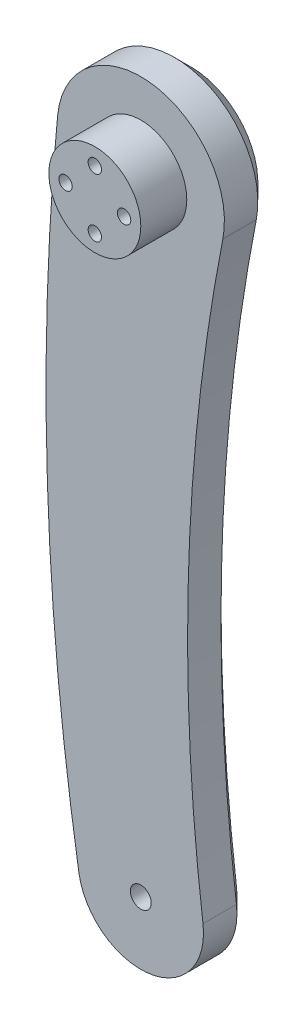
ISO-10303-21;
HEADER;
FILE_DESCRIPTION(('STEP AP214'),'2;1');
FILE_NAME('part.step','',(''),(''),'','','');
FILE_SCHEMA(('AUTOMOTIVE_DESIGN { 1 0 10303 214 1 1 1 1 }'));
ENDSEC;
DATA;
#1=APPLICATION_CONTEXT('core data for automotive mechanical design processes');
#2=APPLICATION_PROTOCOL_DEFINITION('international standard','automotive_design',2000,#1);
#3=PRODUCT_CONTEXT('',#1,'mechanical');
#4=PRODUCT('Part','Part','',(#3));
#5=PRODUCT_RELATED_PRODUCT_CATEGORY('part','',(#4));
#6=PRODUCT_DEFINITION_FORMATION('','',#4);
#7=PRODUCT_DEFINITION_CONTEXT('part definition',#1,'design');
#8=PRODUCT_DEFINITION('design','',#6,#7);
#9=PRODUCT_DEFINITION_SHAPE('','',#8);
#10=(LENGTH_UNIT() NAMED_UNIT(*) SI_UNIT(.MILLI.,.METRE.));
#11=(NAMED_UNIT(*) PLANE_ANGLE_UNIT() SI_UNIT($,.RADIAN.));
#12=(NAMED_UNIT(*) SI_UNIT($,.STERADIAN.) SOLID_ANGLE_UNIT());
#13=UNCERTAINTY_MEASURE_WITH_UNIT(LENGTH_MEASURE(1.E-05),#10,'distance_accuracy_value','');
#14=(GEOMETRIC_REPRESENTATION_CONTEXT(3) GLOBAL_UNCERTAINTY_ASSIGNED_CONTEXT((#13)) GLOBAL_UNIT_ASSIGNED_CONTEXT((#10,
#11,#12)) REPRESENTATION_CONTEXT('',''));
#15=CARTESIAN_POINT('',(0.,0.,0.));
#16=DIRECTION('',(0.,0.,1.));
#17=DIRECTION('',(1.,0.,0.));
#18=AXIS2_PLACEMENT_3D('',#15,#16,#17);
#19=CARTESIAN_POINT('',(-7.,0.,-0.000999999999999265));
#20=DIRECTION('',(0.,0.,1.));
#21=DIRECTION('',(1.,0.,0.));
#22=AXIS2_PLACEMENT_3D('',#19,#20,#21);
#23=CYLINDRICAL_SURFACE('',#22,1.6);
#24=CARTESIAN_POINT('',(-7.,0.,23.));
#25=DIRECTION('',(0.,0.,1.));
#26=DIRECTION('',(1.,0.,0.));
#27=AXIS2_PLACEMENT_3D('',#24,#25,#26);
#28=CIRCLE('',#27,1.6);
#29=CARTESIAN_POINT('',(-5.4,0.,23.));
#30=VERTEX_POINT('',#29);
#31=EDGE_CURVE('E160',#30,#30,#28,.T.);
#32=ORIENTED_EDGE('',*,*,#31,.T.);
#33=EDGE_LOOP('',(#32));
#34=FACE_BOUND('',#33,.T.);
#35=CARTESIAN_POINT('',(-7.,0.,18.));
#36=DIRECTION('',(0.,0.,-1.));
#37=DIRECTION('',(-1.,0.,0.));
#38=AXIS2_PLACEMENT_3D('',#35,#36,#37);
#39=CIRCLE('',#38,1.6);
#40=CARTESIAN_POINT('',(-8.6,0.,18.));
#41=VERTEX_POINT('',#40);
#42=EDGE_CURVE('E42',#41,#41,#39,.F.);
#43=ORIENTED_EDGE('',*,*,#42,.F.);
#44=EDGE_LOOP('',(#43));
#45=FACE_BOUND('',#44,.T.);
#46=ADVANCED_FACE('F37',(#34,#45),#23,.F.);
#47=CARTESIAN_POINT('',(0.,-7.,-0.000999999999999265));
#48=DIRECTION('',(0.,0.,1.));
#49=DIRECTION('',(1.,0.,0.));
#50=AXIS2_PLACEMENT_3D('',#47,#48,#49);
#51=CYLINDRICAL_SURFACE('',#50,1.6);
#52=CARTESIAN_POINT('',(0.,-7.,23.));
#53=DIRECTION('',(0.,0.,1.));
#54=DIRECTION('',(1.,0.,0.));
#55=AXIS2_PLACEMENT_3D('',#52,#53,#54);
#56=CIRCLE('',#55,1.6);
#57=CARTESIAN_POINT('',(1.6,-7.,23.));
#58=VERTEX_POINT('',#57);
#59=EDGE_CURVE('E165',#58,#58,#56,.T.);
#60=ORIENTED_EDGE('',*,*,#59,.T.);
#61=EDGE_LOOP('',(#60));
#62=FACE_BOUND('',#61,.T.);
#63=CARTESIAN_POINT('',(0.,-7.,18.));
#64=DIRECTION('',(0.,0.,-1.));
#65=DIRECTION('',(-1.,0.,0.));
#66=AXIS2_PLACEMENT_3D('',#63,#64,#65);
#67=CIRCLE('',#66,1.6);
#68=CARTESIAN_POINT('',(-1.6,-7.,18.));
#69=VERTEX_POINT('',#68);
#70=EDGE_CURVE('E151',#69,#69,#67,.F.);
#71=ORIENTED_EDGE('',*,*,#70,.F.);
#72=EDGE_LOOP('',(#71));
#73=FACE_BOUND('',#72,.T.);
#74=ADVANCED_FACE('F216',(#62,#73),#51,.F.);
#75=CARTESIAN_POINT('',(7.,0.,-0.000999999999999265));
#76=DIRECTION('',(0.,0.,1.));
#77=DIRECTION('',(1.,0.,0.));
#78=AXIS2_PLACEMENT_3D('',#75,#76,#77);
#79=CYLINDRICAL_SURFACE('',#78,1.6);
#80=CARTESIAN_POINT('',(7.,0.,23.));
#81=DIRECTION('',(0.,0.,1.));
#82=DIRECTION('',(1.,0.,0.));
#83=AXIS2_PLACEMENT_3D('',#80,#81,#82);
#84=CIRCLE('',#83,1.6);
#85=CARTESIAN_POINT('',(8.6,0.,23.));
#86=VERTEX_POINT('',#85);
#87=EDGE_CURVE('E173',#86,#86,#84,.T.);
#88=ORIENTED_EDGE('',*,*,#87,.T.);
#89=EDGE_LOOP('',(#88));
#90=FACE_BOUND('',#89,.T.);
#91=CARTESIAN_POINT('',(7.,0.,18.));
#92=DIRECTION('',(0.,0.,-1.));
#93=DIRECTION('',(-1.,0.,0.));
#94=AXIS2_PLACEMENT_3D('',#91,#92,#93);
#95=CIRCLE('',#94,1.6);
#96=CARTESIAN_POINT('',(5.4,0.,18.));
#97=VERTEX_POINT('',#96);
#98=EDGE_CURVE('E148',#97,#97,#95,.F.);
#99=ORIENTED_EDGE('',*,*,#98,.F.);
#100=EDGE_LOOP('',(#99));
#101=FACE_BOUND('',#100,.T.);
#102=ADVANCED_FACE('F222',(#90,#101),#79,.F.);
#103=CARTESIAN_POINT('',(0.,7.,-0.000999999999999265));
#104=DIRECTION('',(0.,0.,1.));
#105=DIRECTION('',(1.,0.,0.));
#106=AXIS2_PLACEMENT_3D('',#103,#104,#105);
#107=CYLINDRICAL_SURFACE('',#106,1.6);
#108=CARTESIAN_POINT('',(0.,7.,23.));
#109=DIRECTION('',(0.,0.,1.));
#110=DIRECTION('',(1.,0.,0.));
#111=AXIS2_PLACEMENT_3D('',#108,#109,#110);
#112=CIRCLE('',#111,1.6);
#113=CARTESIAN_POINT('',(1.6,7.,23.));
#114=VERTEX_POINT('',#113);
#115=EDGE_CURVE('E156',#114,#114,#112,.T.);
#116=ORIENTED_EDGE('',*,*,#115,.T.);
#117=EDGE_LOOP('',(#116));
#118=FACE_BOUND('',#117,.T.);
#119=CARTESIAN_POINT('',(0.,7.,18.));
#120=DIRECTION('',(0.,0.,-1.));
#121=DIRECTION('',(-1.,0.,0.));
#122=AXIS2_PLACEMENT_3D('',#119,#120,#121);
#123=CIRCLE('',#122,1.6);
#124=CARTESIAN_POINT('',(-1.6,7.,18.));
#125=VERTEX_POINT('',#124);
#126=EDGE_CURVE('E145',#125,#125,#123,.F.);
#127=ORIENTED_EDGE('',*,*,#126,.F.);
#128=EDGE_LOOP('',(#127));
#129=FACE_BOUND('',#128,.T.);
#130=ADVANCED_FACE('F230',(#118,#129),#107,.F.);
#131=CARTESIAN_POINT('',(288.665244294995,-102.791666666667,12.));
#132=DIRECTION('',(0.,0.,1.));
#133=DIRECTION('',(1.,0.,0.));
#134=AXIS2_PLACEMENT_3D('',#131,#132,#133);
#135=PLANE('',#134);
#136=CARTESIAN_POINT('',(577.330488589989,-55.5833333333334,12.));
#137=DIRECTION('',(0.,0.,1.));
#138=DIRECTION('',(1.,0.,0.));
#139=AXIS2_PLACEMENT_3D('',#136,#137,#138);
#140=CIRCLE('',#139,600.);
#141=CARTESIAN_POINT('',(-19.9079478824134,1.91666666666666,12.));
#142=VERTEX_POINT('',#141);
#143=CARTESIAN_POINT('',(-14.8033458612818,-152.42094017094,12.));
#144=VERTEX_POINT('',#143);
#145=EDGE_CURVE('E105',#142,#144,#140,.T.);
#146=ORIENTED_EDGE('',*,*,#145,.T.);
#147=CARTESIAN_POINT('',(0.,-150.,12.));
#148=DIRECTION('',(0.,0.,1.));
#149=DIRECTION('',(1.,0.,0.));
#150=AXIS2_PLACEMENT_3D('',#147,#148,#149);
#151=CIRCLE('',#150,15.);
#152=CARTESIAN_POINT('',(14.8770423434527,-148.083333333333,12.));
#153=VERTEX_POINT('',#152);
#154=EDGE_CURVE('E94',#144,#153,#151,.T.);
#155=ORIENTED_EDGE('',*,*,#154,.T.);
#156=CARTESIAN_POINT('',(461.188312647038,-90.5833333333334,12.));
#157=DIRECTION('',(0.,0.,-1.));
#158=DIRECTION('',(1.,0.,0.));
#159=AXIS2_PLACEMENT_3D('',#156,#157,#158);
#160=CIRCLE('',#159,450.);
#161=CARTESIAN_POINT('',(19.625034580725,-3.85460992907802,12.));
#162=VERTEX_POINT('',#161);
#163=EDGE_CURVE('E104',#153,#162,#160,.T.);
#164=ORIENTED_EDGE('',*,*,#163,.T.);
#165=CARTESIAN_POINT('',(0.,0.,12.));
#166=DIRECTION('',(0.,0.,1.));
#167=DIRECTION('',(1.,0.,0.));
#168=AXIS2_PLACEMENT_3D('',#165,#166,#167);
#169=CIRCLE('',#168,20.);
#170=EDGE_CURVE('E111',#162,#142,#169,.T.);
#171=ORIENTED_EDGE('',*,*,#170,.T.);
#172=EDGE_LOOP('',(#146,#155,#164,#171));
#173=FACE_BOUND('',#172,.T.);
#174=CARTESIAN_POINT('',(0.,-150.,12.));
#175=DIRECTION('',(0.,0.,1.));
#176=DIRECTION('',(1.,0.,0.));
#177=AXIS2_PLACEMENT_3D('',#174,#175,#176);
#178=CIRCLE('',#177,2.5);
#179=CARTESIAN_POINT('',(2.49999999999999,-150.,12.));
#180=VERTEX_POINT('',#179);
#181=EDGE_CURVE('E180',#180,#180,#178,.T.);
#182=ORIENTED_EDGE('',*,*,#181,.F.);
#183=EDGE_LOOP('',(#182));
#184=FACE_BOUND('',#183,.T.);
#185=CARTESIAN_POINT('',(0.,0.,12.));
#186=DIRECTION('',(0.,0.,1.));
#187=DIRECTION('',(1.,0.,0.));
#188=AXIS2_PLACEMENT_3D('',#185,#186,#187);
#189=CIRCLE('',#188,11.);
#190=CARTESIAN_POINT('',(11.,0.,12.));
#191=VERTEX_POINT('',#190);
#192=EDGE_CURVE('E176',#191,#191,#189,.T.);
#193=ORIENTED_EDGE('',*,*,#192,.F.);
#194=EDGE_LOOP('',(#193));
#195=FACE_BOUND('',#194,.T.);
#196=ADVANCED_FACE('F108',(#173,#184,#195),#135,.T.);
#197=CARTESIAN_POINT('',(577.330488589989,-55.5833333333334,12.));
#198=DIRECTION('',(0.,0.,-1.));
#199=DIRECTION('',(-1.,0.,0.));
#200=AXIS2_PLACEMENT_3D('',#197,#198,#199);
#201=CYLINDRICAL_SURFACE('',#200,600.);
#202=DIRECTION('',(0.,0.,-1.));
#203=VECTOR('',#202,1.);
#204=CARTESIAN_POINT('',(-19.9079478824134,1.91666666666666,12.));
#205=LINE('',#204,#203);
#206=CARTESIAN_POINT('',(-19.9079478824134,1.91666666666666,4.));
#207=VERTEX_POINT('',#206);
#208=EDGE_CURVE('E189',#142,#207,#205,.T.);
#209=ORIENTED_EDGE('',*,*,#208,.T.);
#210=CARTESIAN_POINT('',(577.330488589989,-55.5833333333334,4.));
#211=DIRECTION('',(0.,0.,1.));
#212=DIRECTION('',(1.,0.,0.));
#213=AXIS2_PLACEMENT_3D('',#210,#211,#212);
#214=CIRCLE('',#213,600.);
#215=CARTESIAN_POINT('',(-14.8033458612818,-152.42094017094,4.));
#216=VERTEX_POINT('',#215);
#217=EDGE_CURVE('E11',#207,#216,#214,.T.);
#218=ORIENTED_EDGE('',*,*,#217,.T.);
#219=DIRECTION('',(0.,0.,-1.));
#220=VECTOR('',#219,1.);
#221=CARTESIAN_POINT('',(-14.8033458612818,-152.42094017094,12.));
#222=LINE('',#221,#220);
#223=EDGE_CURVE('E99',#144,#216,#222,.T.);
#224=ORIENTED_EDGE('',*,*,#223,.F.);
#225=ORIENTED_EDGE('',*,*,#145,.F.);
#226=EDGE_LOOP('',(#209,#218,#224,#225));
#227=FACE_BOUND('',#226,.T.);
#228=ADVANCED_FACE('F115',(#227),#201,.T.);
#229=CARTESIAN_POINT('',(0.,-150.,12.));
#230=DIRECTION('',(0.,0.,-1.));
#231=DIRECTION('',(-1.,0.,0.));
#232=AXIS2_PLACEMENT_3D('',#229,#230,#231);
#233=CYLINDRICAL_SURFACE('',#232,15.);
#234=ORIENTED_EDGE('',*,*,#223,.T.);
#235=CARTESIAN_POINT('',(0.,-150.,4.));
#236=DIRECTION('',(0.,0.,1.));
#237=DIRECTION('',(1.,0.,0.));
#238=AXIS2_PLACEMENT_3D('',#235,#236,#237);
#239=CIRCLE('',#238,15.);
#240=CARTESIAN_POINT('',(14.8770423434527,-148.083333333333,4.));
#241=VERTEX_POINT('',#240);
#242=EDGE_CURVE('E117',#216,#241,#239,.T.);
#243=ORIENTED_EDGE('',*,*,#242,.T.);
#244=DIRECTION('',(0.,0.,-1.));
#245=VECTOR('',#244,1.);
#246=CARTESIAN_POINT('',(14.8770423434527,-148.083333333333,12.));
#247=LINE('',#246,#245);
#248=EDGE_CURVE('E101',#153,#241,#247,.T.);
#249=ORIENTED_EDGE('',*,*,#248,.F.);
#250=ORIENTED_EDGE('',*,*,#154,.F.);
#251=EDGE_LOOP('',(#234,#243,#249,#250));
#252=FACE_BOUND('',#251,.T.);
#253=ADVANCED_FACE('F96',(#252),#233,.T.);
#254=CARTESIAN_POINT('',(461.188312647038,-90.5833333333334,12.));
#255=DIRECTION('',(0.,0.,-1.));
#256=DIRECTION('',(-1.,0.,0.));
#257=AXIS2_PLACEMENT_3D('',#254,#255,#256);
#258=CYLINDRICAL_SURFACE('',#257,450.);
#259=ORIENTED_EDGE('',*,*,#248,.T.);
#260=CARTESIAN_POINT('',(461.188312647038,-90.5833333333334,4.));
#261=DIRECTION('',(0.,0.,1.));
#262=DIRECTION('',(1.,0.,0.));
#263=AXIS2_PLACEMENT_3D('',#260,#261,#262);
#264=CIRCLE('',#263,450.);
#265=CARTESIAN_POINT('',(19.625034580725,-3.85460992907802,4.));
#266=VERTEX_POINT('',#265);
#267=EDGE_CURVE('E62',#241,#266,#264,.F.);
#268=ORIENTED_EDGE('',*,*,#267,.T.);
#269=DIRECTION('',(0.,0.,-1.));
#270=VECTOR('',#269,1.);
#271=CARTESIAN_POINT('',(19.625034580725,-3.85460992907802,12.));
#272=LINE('',#271,#270);
#273=EDGE_CURVE('E121',#162,#266,#272,.T.);
#274=ORIENTED_EDGE('',*,*,#273,.F.);
#275=ORIENTED_EDGE('',*,*,#163,.F.);
#276=EDGE_LOOP('',(#259,#268,#274,#275));
#277=FACE_BOUND('',#276,.T.);
#278=ADVANCED_FACE('F236',(#277),#258,.F.);
#279=CARTESIAN_POINT('',(0.,0.,12.));
#280=DIRECTION('',(0.,0.,-1.));
#281=DIRECTION('',(-1.,0.,0.));
#282=AXIS2_PLACEMENT_3D('',#279,#280,#281);
#283=CYLINDRICAL_SURFACE('',#282,20.);
#284=ORIENTED_EDGE('',*,*,#273,.T.);
#285=CARTESIAN_POINT('',(0.,0.,4.));
#286=DIRECTION('',(0.,0.,1.));
#287=DIRECTION('',(1.,0.,0.));
#288=AXIS2_PLACEMENT_3D('',#285,#286,#287);
#289=CIRCLE('',#288,20.);
#290=EDGE_CURVE('E47',#266,#207,#289,.T.);
#291=ORIENTED_EDGE('',*,*,#290,.T.);
#292=ORIENTED_EDGE('',*,*,#208,.F.);
#293=ORIENTED_EDGE('',*,*,#170,.F.);
#294=EDGE_LOOP('',(#284,#291,#292,#293));
#295=FACE_BOUND('',#294,.T.);
#296=ADVANCED_FACE('F190',(#295),#283,.T.);
#297=CARTESIAN_POINT('',(288.665244294995,-102.791666666667,0.));
#298=DIRECTION('',(0.,0.,1.));
#299=DIRECTION('',(1.,0.,0.));
#300=AXIS2_PLACEMENT_3D('',#297,#298,#299);
#301=PLANE('',#300);
#302=CARTESIAN_POINT('',(0.,7.,0.));
#303=DIRECTION('',(0.,0.,-1.));
#304=DIRECTION('',(-1.,0.,0.));
#305=AXIS2_PLACEMENT_3D('',#302,#303,#304);
#306=CIRCLE('',#305,2.5);
#307=CARTESIAN_POINT('',(-2.5,7.,0.));
#308=VERTEX_POINT('',#307);
#309=EDGE_CURVE('E323',#308,#308,#306,.T.);
#310=ORIENTED_EDGE('',*,*,#309,.F.);
#311=EDGE_LOOP('',(#310));
#312=FACE_BOUND('',#311,.T.);
#313=CARTESIAN_POINT('',(-7.,0.,0.));
#314=DIRECTION('',(0.,0.,-1.));
#315=DIRECTION('',(-1.,0.,0.));
#316=AXIS2_PLACEMENT_3D('',#313,#314,#315);
#317=CIRCLE('',#316,2.5);
#318=CARTESIAN_POINT('',(-9.5,0.,0.));
#319=VERTEX_POINT('',#318);
#320=EDGE_CURVE('E331',#319,#319,#317,.T.);
#321=ORIENTED_EDGE('',*,*,#320,.F.);
#322=EDGE_LOOP('',(#321));
#323=FACE_BOUND('',#322,.T.);
#324=CARTESIAN_POINT('',(0.,-7.,0.));
#325=DIRECTION('',(0.,0.,-1.));
#326=DIRECTION('',(-1.,0.,0.));
#327=AXIS2_PLACEMENT_3D('',#324,#325,#326);
#328=CIRCLE('',#327,2.5);
#329=CARTESIAN_POINT('',(-2.5,-7.,0.));
#330=VERTEX_POINT('',#329);
#331=EDGE_CURVE('E337',#330,#330,#328,.T.);
#332=ORIENTED_EDGE('',*,*,#331,.F.);
#333=EDGE_LOOP('',(#332));
#334=FACE_BOUND('',#333,.T.);
#335=CARTESIAN_POINT('',(7.,0.,0.));
#336=DIRECTION('',(0.,0.,-1.));
#337=DIRECTION('',(-1.,0.,0.));
#338=AXIS2_PLACEMENT_3D('',#335,#336,#337);
#339=CIRCLE('',#338,2.5);
#340=CARTESIAN_POINT('',(4.5,0.,0.));
#341=VERTEX_POINT('',#340);
#342=EDGE_CURVE('E168',#341,#341,#339,.T.);
#343=ORIENTED_EDGE('',*,*,#342,.F.);
#344=EDGE_LOOP('',(#343));
#345=FACE_BOUND('',#344,.T.);
#346=CARTESIAN_POINT('',(0.,-150.,0.));
#347=DIRECTION('',(0.,0.,1.));
#348=DIRECTION('',(1.,0.,0.));
#349=AXIS2_PLACEMENT_3D('',#346,#347,#348);
#350=CIRCLE('',#349,2.5);
#351=CARTESIAN_POINT('',(2.49999999999999,-150.,0.));
#352=VERTEX_POINT('',#351);
#353=EDGE_CURVE('E138',#352,#352,#350,.F.);
#354=ORIENTED_EDGE('',*,*,#353,.F.);
#355=EDGE_LOOP('',(#354));
#356=FACE_BOUND('',#355,.T.);
#357=CARTESIAN_POINT('',(461.188312647038,-90.5833333333334,0.));
#358=DIRECTION('',(0.,0.,1.));
#359=DIRECTION('',(1.,0.,0.));
#360=AXIS2_PLACEMENT_3D('',#357,#358,#359);
#361=CIRCLE('',#360,454.);
#362=CARTESIAN_POINT('',(15.7000276645799,-3.08368794326239,0.));
#363=VERTEX_POINT('',#362);
#364=CARTESIAN_POINT('',(10.9098310518651,-148.594444444444,0.));
#365=VERTEX_POINT('',#364);
#366=EDGE_CURVE('E128',#363,#365,#361,.T.);
#367=ORIENTED_EDGE('',*,*,#366,.T.);
#368=CARTESIAN_POINT('',(0.,-150.,0.));
#369=DIRECTION('',(0.,0.,1.));
#370=DIRECTION('',(1.,0.,0.));
#371=AXIS2_PLACEMENT_3D('',#368,#369,#370);
#372=CIRCLE('',#371,10.9999999999998);
#373=CARTESIAN_POINT('',(-10.8557869649398,-151.775356125356,0.));
#374=VERTEX_POINT('',#373);
#375=EDGE_CURVE('E130',#365,#374,#372,.F.);
#376=ORIENTED_EDGE('',*,*,#375,.T.);
#377=CARTESIAN_POINT('',(577.330488589989,-55.5833333333334,0.));
#378=DIRECTION('',(0.,0.,1.));
#379=DIRECTION('',(1.,0.,0.));
#380=AXIS2_PLACEMENT_3D('',#377,#378,#379);
#381=CIRCLE('',#380,596.);
#382=CARTESIAN_POINT('',(-15.9263583059306,1.53333333333331,0.));
#383=VERTEX_POINT('',#382);
#384=EDGE_CURVE('E119',#374,#383,#381,.F.);
#385=ORIENTED_EDGE('',*,*,#384,.T.);
#386=CARTESIAN_POINT('',(0.,0.,0.));
#387=DIRECTION('',(0.,0.,1.));
#388=DIRECTION('',(1.,0.,0.));
#389=AXIS2_PLACEMENT_3D('',#386,#387,#388);
#390=CIRCLE('',#389,15.9999999999998);
#391=EDGE_CURVE('E126',#383,#363,#390,.F.);
#392=ORIENTED_EDGE('',*,*,#391,.T.);
#393=EDGE_LOOP('',(#367,#376,#385,#392));
#394=FACE_BOUND('',#393,.T.);
#395=ADVANCED_FACE('F201',(#312,#323,#334,#345,#356,#394),#301,.F.);
#396=CARTESIAN_POINT('',(0.,0.,4.));
#397=DIRECTION('',(0.,0.,1.));
#398=DIRECTION('',(1.,0.,0.));
#399=AXIS2_PLACEMENT_3D('',#396,#397,#398);
#400=CONICAL_SURFACE('',#399,20.,0.785398163397466);
#401=DIRECTION('',(0.69384975165257,-0.136281040984005,0.707106781186535));
#402=VECTOR('',#401,1.);
#403=CARTESIAN_POINT('',(15.7000276645799,-3.08368794326239,0.));
#404=LINE('',#403,#402);
#405=EDGE_CURVE('E140',#363,#266,#404,.T.);
#406=ORIENTED_EDGE('',*,*,#405,.F.);
#407=ORIENTED_EDGE('',*,*,#391,.F.);
#408=DIRECTION('',(0.703852247358157,-0.0677643998637131,-0.707106781186535));
#409=VECTOR('',#408,1.);
#410=CARTESIAN_POINT('',(-19.9079478824134,1.91666666666666,4.));
#411=LINE('',#410,#409);
#412=EDGE_CURVE('E113',#207,#383,#411,.T.);
#413=ORIENTED_EDGE('',*,*,#412,.F.);
#414=ORIENTED_EDGE('',*,*,#290,.F.);
#415=EDGE_LOOP('',(#406,#407,#413,#414));
#416=FACE_BOUND('',#415,.T.);
#417=ADVANCED_FACE('F40',(#416),#400,.T.);
#418=CARTESIAN_POINT('',(577.330488589989,-55.5833333333334,4.));
#419=DIRECTION('',(0.,0.,1.));
#420=DIRECTION('',(1.,0.,0.));
#421=AXIS2_PLACEMENT_3D('',#418,#419,#420);
#422=CONICAL_SURFACE('',#421,600.,0.785398163397462);
#423=ORIENTED_EDGE('',*,*,#412,.T.);
#424=ORIENTED_EDGE('',*,*,#384,.F.);
#425=DIRECTION('',(0.697836416184156,0.114124214114583,-0.707106781186535));
#426=VECTOR('',#425,1.);
#427=CARTESIAN_POINT('',(-14.8033458612818,-152.42094017094,4.));
#428=LINE('',#427,#426);
#429=EDGE_CURVE('E137',#216,#374,#428,.T.);
#430=ORIENTED_EDGE('',*,*,#429,.F.);
#431=ORIENTED_EDGE('',*,*,#217,.F.);
#432=EDGE_LOOP('',(#423,#424,#430,#431));
#433=FACE_BOUND('',#432,.T.);
#434=ADVANCED_FACE('F207',(#433),#422,.T.);
#435=CARTESIAN_POINT('',(461.188312647038,-90.5833333333334,4.));
#436=DIRECTION('',(0.,0.,-1.));
#437=DIRECTION('',(-1.,0.,0.));
#438=AXIS2_PLACEMENT_3D('',#435,#436,#437);
#439=CONICAL_SURFACE('',#438,450.,0.785398163397469);
#440=ORIENTED_EDGE('',*,*,#405,.T.);
#441=ORIENTED_EDGE('',*,*,#267,.F.);
#442=DIRECTION('',(0.701310501670338,0.0903525331516257,0.707106781186535));
#443=VECTOR('',#442,1.);
#444=CARTESIAN_POINT('',(10.9098310518651,-148.594444444444,0.));
#445=LINE('',#444,#443);
#446=EDGE_CURVE('E135',#365,#241,#445,.T.);
#447=ORIENTED_EDGE('',*,*,#446,.F.);
#448=ORIENTED_EDGE('',*,*,#366,.F.);
#449=EDGE_LOOP('',(#440,#441,#447,#448));
#450=FACE_BOUND('',#449,.T.);
#451=ADVANCED_FACE('F197',(#450),#439,.F.);
#452=CARTESIAN_POINT('',(0.,-150.,4.));
#453=DIRECTION('',(0.,0.,1.));
#454=DIRECTION('',(1.,0.,0.));
#455=AXIS2_PLACEMENT_3D('',#452,#453,#454);
#456=CONICAL_SURFACE('',#455,15.,0.785398163397466);
#457=ORIENTED_EDGE('',*,*,#429,.T.);
#458=ORIENTED_EDGE('',*,*,#375,.F.);
#459=ORIENTED_EDGE('',*,*,#446,.T.);
#460=ORIENTED_EDGE('',*,*,#242,.F.);
#461=EDGE_LOOP('',(#457,#458,#459,#460));
#462=FACE_BOUND('',#461,.T.);
#463=ADVANCED_FACE('F203',(#462),#456,.T.);
#464=CARTESIAN_POINT('',(0.,-150.,-0.000999999999999265));
#465=DIRECTION('',(0.,0.,1.));
#466=DIRECTION('',(1.,0.,0.));
#467=AXIS2_PLACEMENT_3D('',#464,#465,#466);
#468=CYLINDRICAL_SURFACE('',#467,2.5);
#469=ORIENTED_EDGE('',*,*,#181,.T.);
#470=EDGE_LOOP('',(#469));
#471=FACE_BOUND('',#470,.T.);
#472=ORIENTED_EDGE('',*,*,#353,.T.);
#473=EDGE_LOOP('',(#472));
#474=FACE_BOUND('',#473,.T.);
#475=ADVANCED_FACE('F248',(#471,#474),#468,.F.);
#476=CARTESIAN_POINT('',(0.,0.,23.));
#477=DIRECTION('',(0.,0.,1.));
#478=DIRECTION('',(1.,0.,0.));
#479=AXIS2_PLACEMENT_3D('',#476,#477,#478);
#480=PLANE('',#479);
#481=ORIENTED_EDGE('',*,*,#31,.F.);
#482=EDGE_LOOP('',(#481));
#483=FACE_BOUND('',#482,.T.);
#484=ORIENTED_EDGE('',*,*,#87,.F.);
#485=EDGE_LOOP('',(#484));
#486=FACE_BOUND('',#485,.T.);
#487=CARTESIAN_POINT('',(0.,0.,23.));
#488=DIRECTION('',(0.,0.,1.));
#489=DIRECTION('',(1.,0.,0.));
#490=AXIS2_PLACEMENT_3D('',#487,#488,#489);
#491=CIRCLE('',#490,11.);
#492=CARTESIAN_POINT('',(11.,0.,23.));
#493=VERTEX_POINT('',#492);
#494=EDGE_CURVE('E177',#493,#493,#491,.T.);
#495=ORIENTED_EDGE('',*,*,#494,.T.);
#496=EDGE_LOOP('',(#495));
#497=FACE_BOUND('',#496,.T.);
#498=ORIENTED_EDGE('',*,*,#59,.F.);
#499=EDGE_LOOP('',(#498));
#500=FACE_BOUND('',#499,.T.);
#501=ORIENTED_EDGE('',*,*,#115,.F.);
#502=EDGE_LOOP('',(#501));
#503=FACE_BOUND('',#502,.T.);
#504=ADVANCED_FACE('F258',(#483,#486,#497,#500,#503),#480,.T.);
#505=CARTESIAN_POINT('',(0.,0.,23.));
#506=DIRECTION('',(0.,0.,-1.));
#507=DIRECTION('',(-1.,0.,0.));
#508=AXIS2_PLACEMENT_3D('',#505,#506,#507);
#509=CYLINDRICAL_SURFACE('',#508,11.);
#510=ORIENTED_EDGE('',*,*,#494,.F.);
#511=EDGE_LOOP('',(#510));
#512=FACE_BOUND('',#511,.T.);
#513=ORIENTED_EDGE('',*,*,#192,.T.);
#514=EDGE_LOOP('',(#513));
#515=FACE_BOUND('',#514,.T.);
#516=ADVANCED_FACE('F264',(#512,#515),#509,.T.);
#517=CARTESIAN_POINT('',(0.,7.,18.));
#518=DIRECTION('',(0.,0.,-1.));
#519=DIRECTION('',(-1.,0.,0.));
#520=AXIS2_PLACEMENT_3D('',#517,#518,#519);
#521=PLANE('',#520);
#522=CARTESIAN_POINT('',(0.,7.,18.));
#523=DIRECTION('',(0.,0.,-1.));
#524=DIRECTION('',(-1.,0.,0.));
#525=AXIS2_PLACEMENT_3D('',#522,#523,#524);
#526=CIRCLE('',#525,2.5);
#527=CARTESIAN_POINT('',(-2.5,7.,18.));
#528=VERTEX_POINT('',#527);
#529=EDGE_CURVE('E149',#528,#528,#526,.T.);
#530=ORIENTED_EDGE('',*,*,#529,.T.);
#531=EDGE_LOOP('',(#530));
#532=FACE_BOUND('',#531,.T.);
#533=ORIENTED_EDGE('',*,*,#126,.T.);
#534=EDGE_LOOP('',(#533));
#535=FACE_BOUND('',#534,.T.);
#536=ADVANCED_FACE('F292',(#532,#535),#521,.T.);
#537=CARTESIAN_POINT('',(0.,7.,18.));
#538=DIRECTION('',(0.,0.,-1.));
#539=DIRECTION('',(-1.,0.,0.));
#540=AXIS2_PLACEMENT_3D('',#537,#538,#539);
#541=CYLINDRICAL_SURFACE('',#540,2.5);
#542=ORIENTED_EDGE('',*,*,#529,.F.);
#543=EDGE_LOOP('',(#542));
#544=FACE_BOUND('',#543,.T.);
#545=ORIENTED_EDGE('',*,*,#309,.T.);
#546=EDGE_LOOP('',(#545));
#547=FACE_BOUND('',#546,.T.);
#548=ADVANCED_FACE('F282',(#544,#547),#541,.F.);
#549=CARTESIAN_POINT('',(7.,0.,18.));
#550=DIRECTION('',(0.,0.,-1.));
#551=DIRECTION('',(-1.,0.,0.));
#552=AXIS2_PLACEMENT_3D('',#549,#550,#551);
#553=PLANE('',#552);
#554=CARTESIAN_POINT('',(7.,0.,18.));
#555=DIRECTION('',(0.,0.,-1.));
#556=DIRECTION('',(-1.,0.,0.));
#557=AXIS2_PLACEMENT_3D('',#554,#555,#556);
#558=CIRCLE('',#557,2.5);
#559=CARTESIAN_POINT('',(4.5,0.,18.));
#560=VERTEX_POINT('',#559);
#561=EDGE_CURVE('E339',#560,#560,#558,.T.);
#562=ORIENTED_EDGE('',*,*,#561,.T.);
#563=EDGE_LOOP('',(#562));
#564=FACE_BOUND('',#563,.T.);
#565=ORIENTED_EDGE('',*,*,#98,.T.);
#566=EDGE_LOOP('',(#565));
#567=FACE_BOUND('',#566,.T.);
#568=ADVANCED_FACE('F279',(#564,#567),#553,.T.);
#569=CARTESIAN_POINT('',(7.,0.,18.));
#570=DIRECTION('',(0.,0.,-1.));
#571=DIRECTION('',(-1.,0.,0.));
#572=AXIS2_PLACEMENT_3D('',#569,#570,#571);
#573=CYLINDRICAL_SURFACE('',#572,2.5);
#574=ORIENTED_EDGE('',*,*,#561,.F.);
#575=EDGE_LOOP('',(#574));
#576=FACE_BOUND('',#575,.T.);
#577=ORIENTED_EDGE('',*,*,#342,.T.);
#578=EDGE_LOOP('',(#577));
#579=FACE_BOUND('',#578,.T.);
#580=ADVANCED_FACE('F281',(#576,#579),#573,.F.);
#581=CARTESIAN_POINT('',(0.,-7.,18.));
#582=DIRECTION('',(0.,0.,-1.));
#583=DIRECTION('',(-1.,0.,0.));
#584=AXIS2_PLACEMENT_3D('',#581,#582,#583);
#585=PLANE('',#584);
#586=CARTESIAN_POINT('',(0.,-7.,18.));
#587=DIRECTION('',(0.,0.,-1.));
#588=DIRECTION('',(-1.,0.,0.));
#589=AXIS2_PLACEMENT_3D('',#586,#587,#588);
#590=CIRCLE('',#589,2.5);
#591=CARTESIAN_POINT('',(-2.5,-7.,18.));
#592=VERTEX_POINT('',#591);
#593=EDGE_CURVE('E334',#592,#592,#590,.T.);
#594=ORIENTED_EDGE('',*,*,#593,.T.);
#595=EDGE_LOOP('',(#594));
#596=FACE_BOUND('',#595,.T.);
#597=ORIENTED_EDGE('',*,*,#70,.T.);
#598=EDGE_LOOP('',(#597));
#599=FACE_BOUND('',#598,.T.);
#600=ADVANCED_FACE('F289',(#596,#599),#585,.T.);
#601=CARTESIAN_POINT('',(0.,-7.,18.));
#602=DIRECTION('',(0.,0.,-1.));
#603=DIRECTION('',(-1.,0.,0.));
#604=AXIS2_PLACEMENT_3D('',#601,#602,#603);
#605=CYLINDRICAL_SURFACE('',#604,2.5);
#606=ORIENTED_EDGE('',*,*,#593,.F.);
#607=EDGE_LOOP('',(#606));
#608=FACE_BOUND('',#607,.T.);
#609=ORIENTED_EDGE('',*,*,#331,.T.);
#610=EDGE_LOOP('',(#609));
#611=FACE_BOUND('',#610,.T.);
#612=ADVANCED_FACE('F297',(#608,#611),#605,.F.);
#613=CARTESIAN_POINT('',(-7.,0.,18.));
#614=DIRECTION('',(0.,0.,-1.));
#615=DIRECTION('',(-1.,0.,0.));
#616=AXIS2_PLACEMENT_3D('',#613,#614,#615);
#617=PLANE('',#616);
#618=CARTESIAN_POINT('',(-7.,0.,18.));
#619=DIRECTION('',(0.,0.,-1.));
#620=DIRECTION('',(-1.,0.,0.));
#621=AXIS2_PLACEMENT_3D('',#618,#619,#620);
#622=CIRCLE('',#621,2.5);
#623=CARTESIAN_POINT('',(-9.5,0.,18.));
#624=VERTEX_POINT('',#623);
#625=EDGE_CURVE('E326',#624,#624,#622,.T.);
#626=ORIENTED_EDGE('',*,*,#625,.T.);
#627=EDGE_LOOP('',(#626));
#628=FACE_BOUND('',#627,.T.);
#629=ORIENTED_EDGE('',*,*,#42,.T.);
#630=EDGE_LOOP('',(#629));
#631=FACE_BOUND('',#630,.T.);
#632=ADVANCED_FACE('F300',(#628,#631),#617,.T.);
#633=CARTESIAN_POINT('',(-7.,0.,18.));
#634=DIRECTION('',(0.,0.,-1.));
#635=DIRECTION('',(-1.,0.,0.));
#636=AXIS2_PLACEMENT_3D('',#633,#634,#635);
#637=CYLINDRICAL_SURFACE('',#636,2.5);
#638=ORIENTED_EDGE('',*,*,#625,.F.);
#639=EDGE_LOOP('',(#638));
#640=FACE_BOUND('',#639,.T.);
#641=ORIENTED_EDGE('',*,*,#320,.T.);
#642=EDGE_LOOP('',(#641));
#643=FACE_BOUND('',#642,.T.);
#644=ADVANCED_FACE('F305',(#640,#643),#637,.F.);
#645=CLOSED_SHELL('',(#46,#74,#102,#130,#196,#228,#253,#278,#296,#395,#417,#434,#451,#463,#475,
#504,#516,#536,#548,#568,#580,#600,#612,#632,#644));
#646=MANIFOLD_SOLID_BREP('B2',#645);
#647=ADVANCED_BREP_SHAPE_REPRESENTATION('',(#18,#646),#14);
#648=SHAPE_DEFINITION_REPRESENTATION(#9,#647);
ENDSEC;
END-ISO-10303-21;
